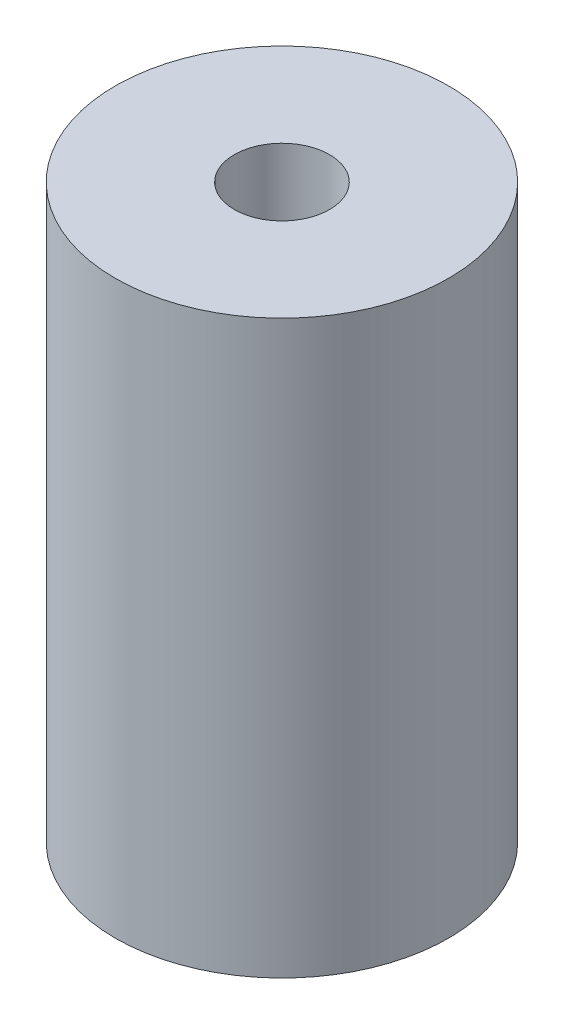
ISO-10303-21;
HEADER;
FILE_DESCRIPTION(('STEP AP214'),'2;1');
FILE_NAME('part.step','',(''),(''),'','','');
FILE_SCHEMA(('AUTOMOTIVE_DESIGN { 1 0 10303 214 1 1 1 1 }'));
ENDSEC;
DATA;
#1=APPLICATION_CONTEXT('core data for automotive mechanical design processes');
#2=APPLICATION_PROTOCOL_DEFINITION('international standard','automotive_design',2000,#1);
#3=PRODUCT_CONTEXT('',#1,'mechanical');
#4=PRODUCT('Part','Part','',(#3));
#5=PRODUCT_RELATED_PRODUCT_CATEGORY('part','',(#4));
#6=PRODUCT_DEFINITION_FORMATION('','',#4);
#7=PRODUCT_DEFINITION_CONTEXT('part definition',#1,'design');
#8=PRODUCT_DEFINITION('design','',#6,#7);
#9=PRODUCT_DEFINITION_SHAPE('','',#8);
#10=(LENGTH_UNIT() NAMED_UNIT(*) SI_UNIT(.MILLI.,.METRE.));
#11=(NAMED_UNIT(*) PLANE_ANGLE_UNIT() SI_UNIT($,.RADIAN.));
#12=(NAMED_UNIT(*) SI_UNIT($,.STERADIAN.) SOLID_ANGLE_UNIT());
#13=UNCERTAINTY_MEASURE_WITH_UNIT(LENGTH_MEASURE(1.E-05),#10,'distance_accuracy_value','');
#14=(GEOMETRIC_REPRESENTATION_CONTEXT(3) GLOBAL_UNCERTAINTY_ASSIGNED_CONTEXT((#13)) GLOBAL_UNIT_ASSIGNED_CONTEXT((#10,
#11,#12)) REPRESENTATION_CONTEXT('',''));
#15=CARTESIAN_POINT('',(0.,0.,0.));
#16=DIRECTION('',(0.,0.,1.));
#17=DIRECTION('',(1.,0.,0.));
#18=AXIS2_PLACEMENT_3D('',#15,#16,#17);
#19=CARTESIAN_POINT('',(0.,12.,0.));
#20=DIRECTION('',(0.,1.,0.));
#21=DIRECTION('',(0.,0.,1.));
#22=AXIS2_PLACEMENT_3D('',#19,#20,#21);
#23=PLANE('',#22);
#24=CARTESIAN_POINT('',(0.,12.,0.));
#25=DIRECTION('',(0.,1.,0.));
#26=DIRECTION('',(0.,0.,1.));
#27=AXIS2_PLACEMENT_3D('',#24,#25,#26);
#28=CIRCLE('',#27,3.5);
#29=CARTESIAN_POINT('',(0.,12.,3.5));
#30=VERTEX_POINT('',#29);
#31=EDGE_CURVE('E10',#30,#30,#28,.T.);
#32=ORIENTED_EDGE('',*,*,#31,.T.);
#33=EDGE_LOOP('',(#32));
#34=FACE_BOUND('',#33,.T.);
#35=CARTESIAN_POINT('',(0.,12.,0.));
#36=DIRECTION('',(0.,1.,0.));
#37=DIRECTION('',(0.,0.,1.));
#38=AXIS2_PLACEMENT_3D('',#35,#36,#37);
#39=CIRCLE('',#38,1.);
#40=CARTESIAN_POINT('',(0.,12.,1.));
#41=VERTEX_POINT('',#40);
#42=EDGE_CURVE('E41',#41,#41,#39,.T.);
#43=ORIENTED_EDGE('',*,*,#42,.F.);
#44=EDGE_LOOP('',(#43));
#45=FACE_BOUND('',#44,.T.);
#46=ADVANCED_FACE('F30',(#34,#45),#23,.T.);
#47=CARTESIAN_POINT('',(0.,0.,0.));
#48=DIRECTION('',(0.,1.,0.));
#49=DIRECTION('',(0.,0.,1.));
#50=AXIS2_PLACEMENT_3D('',#47,#48,#49);
#51=PLANE('',#50);
#52=CARTESIAN_POINT('',(0.,0.,0.));
#53=DIRECTION('',(0.,1.,0.));
#54=DIRECTION('',(0.,0.,1.));
#55=AXIS2_PLACEMENT_3D('',#52,#53,#54);
#56=CIRCLE('',#55,3.5);
#57=CARTESIAN_POINT('',(0.,0.,3.5));
#58=VERTEX_POINT('',#57);
#59=EDGE_CURVE('E34',#58,#58,#56,.T.);
#60=ORIENTED_EDGE('',*,*,#59,.F.);
#61=EDGE_LOOP('',(#60));
#62=FACE_BOUND('',#61,.T.);
#63=CARTESIAN_POINT('',(0.,0.,0.));
#64=DIRECTION('',(0.,1.,0.));
#65=DIRECTION('',(0.,0.,1.));
#66=AXIS2_PLACEMENT_3D('',#63,#64,#65);
#67=CIRCLE('',#66,1.);
#68=CARTESIAN_POINT('',(0.,0.,1.));
#69=VERTEX_POINT('',#68);
#70=EDGE_CURVE('E43',#69,#69,#67,.T.);
#71=ORIENTED_EDGE('',*,*,#70,.T.);
#72=EDGE_LOOP('',(#71));
#73=FACE_BOUND('',#72,.T.);
#74=ADVANCED_FACE('F53',(#62,#73),#51,.F.);
#75=CARTESIAN_POINT('',(0.,12.,0.));
#76=DIRECTION('',(0.,-1.,0.));
#77=DIRECTION('',(0.,0.,-1.));
#78=AXIS2_PLACEMENT_3D('',#75,#76,#77);
#79=CYLINDRICAL_SURFACE('',#78,3.5);
#80=ORIENTED_EDGE('',*,*,#31,.F.);
#81=EDGE_LOOP('',(#80));
#82=FACE_BOUND('',#81,.T.);
#83=ORIENTED_EDGE('',*,*,#59,.T.);
#84=EDGE_LOOP('',(#83));
#85=FACE_BOUND('',#84,.T.);
#86=ADVANCED_FACE('F32',(#82,#85),#79,.T.);
#87=CARTESIAN_POINT('',(0.,12.,0.));
#88=DIRECTION('',(0.,-1.,0.));
#89=DIRECTION('',(0.,0.,-1.));
#90=AXIS2_PLACEMENT_3D('',#87,#88,#89);
#91=CYLINDRICAL_SURFACE('',#90,1.);
#92=ORIENTED_EDGE('',*,*,#42,.T.);
#93=EDGE_LOOP('',(#92));
#94=FACE_BOUND('',#93,.T.);
#95=ORIENTED_EDGE('',*,*,#70,.F.);
#96=EDGE_LOOP('',(#95));
#97=FACE_BOUND('',#96,.T.);
#98=ADVANCED_FACE('F49',(#94,#97),#91,.F.);
#99=CLOSED_SHELL('',(#46,#74,#86,#98));
#100=MANIFOLD_SOLID_BREP('B2',#99);
#101=ADVANCED_BREP_SHAPE_REPRESENTATION('',(#18,#100),#14);
#102=SHAPE_DEFINITION_REPRESENTATION(#9,#101);
ENDSEC;
END-ISO-10303-21;
